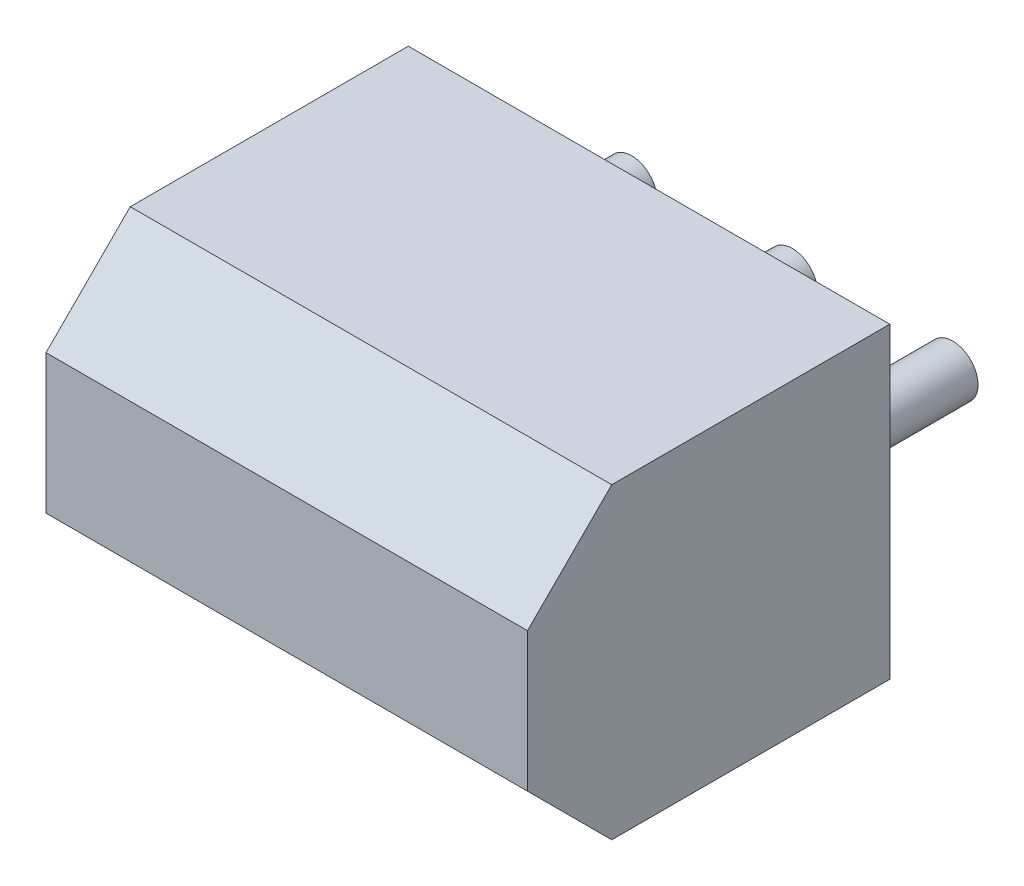
ISO-10303-21;
HEADER;
FILE_DESCRIPTION(('STEP AP214'),'2;1');
FILE_NAME('part.step','',(''),(''),'','','');
FILE_SCHEMA(('AUTOMOTIVE_DESIGN { 1 0 10303 214 1 1 1 1 }'));
ENDSEC;
DATA;
#1=APPLICATION_CONTEXT('core data for automotive mechanical design processes');
#2=APPLICATION_PROTOCOL_DEFINITION('international standard','automotive_design',2000,#1);
#3=PRODUCT_CONTEXT('',#1,'mechanical');
#4=PRODUCT('Part','Part','',(#3));
#5=PRODUCT_RELATED_PRODUCT_CATEGORY('part','',(#4));
#6=PRODUCT_DEFINITION_FORMATION('','',#4);
#7=PRODUCT_DEFINITION_CONTEXT('part definition',#1,'design');
#8=PRODUCT_DEFINITION('design','',#6,#7);
#9=PRODUCT_DEFINITION_SHAPE('','',#8);
#10=(LENGTH_UNIT() NAMED_UNIT(*) SI_UNIT(.MILLI.,.METRE.));
#11=(NAMED_UNIT(*) PLANE_ANGLE_UNIT() SI_UNIT($,.RADIAN.));
#12=(NAMED_UNIT(*) SI_UNIT($,.STERADIAN.) SOLID_ANGLE_UNIT());
#13=UNCERTAINTY_MEASURE_WITH_UNIT(LENGTH_MEASURE(1.E-05),#10,'distance_accuracy_value','');
#14=(GEOMETRIC_REPRESENTATION_CONTEXT(3) GLOBAL_UNCERTAINTY_ASSIGNED_CONTEXT((#13)) GLOBAL_UNIT_ASSIGNED_CONTEXT((#10,
#11,#12)) REPRESENTATION_CONTEXT('',''));
#15=CARTESIAN_POINT('',(0.,0.,0.));
#16=DIRECTION('',(0.,0.,1.));
#17=DIRECTION('',(1.,0.,0.));
#18=AXIS2_PLACEMENT_3D('',#15,#16,#17);
#19=CARTESIAN_POINT('',(0.,0.,0.));
#20=DIRECTION('',(0.,0.,-1.));
#21=DIRECTION('',(-1.,0.,0.));
#22=AXIS2_PLACEMENT_3D('',#19,#20,#21);
#23=PLANE('',#22);
#24=CARTESIAN_POINT('',(9.525,3.7,0.));
#25=DIRECTION('',(0.,0.,-1.));
#26=DIRECTION('',(-1.,0.,0.));
#27=AXIS2_PLACEMENT_3D('',#24,#25,#26);
#28=CIRCLE('',#27,0.6);
#29=CARTESIAN_POINT('',(8.925,3.7,0.));
#30=VERTEX_POINT('',#29);
#31=EDGE_CURVE('E431',#30,#30,#28,.T.);
#32=ORIENTED_EDGE('',*,*,#31,.F.);
#33=EDGE_LOOP('',(#32));
#34=FACE_BOUND('',#33,.T.);
#35=DIRECTION('',(0.,-1.,0.));
#36=VECTOR('',#35,1.);
#37=CARTESIAN_POINT('',(0.,0.,0.));
#38=LINE('',#37,#36);
#39=CARTESIAN_POINT('',(0.,7.3,0.));
#40=VERTEX_POINT('',#39);
#41=CARTESIAN_POINT('',(0.,0.,0.));
#42=VERTEX_POINT('',#41);
#43=EDGE_CURVE('E257',#40,#42,#38,.T.);
#44=ORIENTED_EDGE('',*,*,#43,.F.);
#45=DIRECTION('',(-1.,0.,0.));
#46=VECTOR('',#45,1.);
#47=CARTESIAN_POINT('',(0.,7.3,0.));
#48=LINE('',#47,#46);
#49=CARTESIAN_POINT('',(11.43,7.3,0.));
#50=VERTEX_POINT('',#49);
#51=EDGE_CURVE('E268',#50,#40,#48,.T.);
#52=ORIENTED_EDGE('',*,*,#51,.F.);
#53=DIRECTION('',(0.,1.,0.));
#54=VECTOR('',#53,1.);
#55=CARTESIAN_POINT('',(11.43,0.,0.));
#56=LINE('',#55,#54);
#57=CARTESIAN_POINT('',(11.43,0.,0.));
#58=VERTEX_POINT('',#57);
#59=EDGE_CURVE('E277',#58,#50,#56,.T.);
#60=ORIENTED_EDGE('',*,*,#59,.F.);
#61=DIRECTION('',(1.,0.,0.));
#62=VECTOR('',#61,1.);
#63=CARTESIAN_POINT('',(0.,0.,0.));
#64=LINE('',#63,#62);
#65=EDGE_CURVE('E274',#42,#58,#64,.T.);
#66=ORIENTED_EDGE('',*,*,#65,.F.);
#67=EDGE_LOOP('',(#44,#52,#60,#66));
#68=FACE_BOUND('',#67,.T.);
#69=CARTESIAN_POINT('',(5.715,3.7,0.));
#70=DIRECTION('',(0.,0.,-1.));
#71=DIRECTION('',(-1.,0.,0.));
#72=AXIS2_PLACEMENT_3D('',#69,#70,#71);
#73=CIRCLE('',#72,0.6);
#74=CARTESIAN_POINT('',(5.115,3.7,0.));
#75=VERTEX_POINT('',#74);
#76=EDGE_CURVE('E185',#75,#75,#73,.T.);
#77=ORIENTED_EDGE('',*,*,#76,.F.);
#78=EDGE_LOOP('',(#77));
#79=FACE_BOUND('',#78,.T.);
#80=CARTESIAN_POINT('',(1.905,3.7,0.));
#81=DIRECTION('',(0.,0.,-1.));
#82=DIRECTION('',(-1.,0.,0.));
#83=AXIS2_PLACEMENT_3D('',#80,#81,#82);
#84=CIRCLE('',#83,0.6);
#85=CARTESIAN_POINT('',(1.305,3.7,0.));
#86=VERTEX_POINT('',#85);
#87=EDGE_CURVE('E432',#86,#86,#84,.T.);
#88=ORIENTED_EDGE('',*,*,#87,.F.);
#89=EDGE_LOOP('',(#88));
#90=FACE_BOUND('',#89,.T.);
#91=ADVANCED_FACE('F35',(#34,#68,#79,#90),#23,.T.);
#92=CARTESIAN_POINT('',(0.,0.,8.6));
#93=DIRECTION('',(1.,0.,0.));
#94=DIRECTION('',(0.,0.,-1.));
#95=AXIS2_PLACEMENT_3D('',#92,#93,#94);
#96=PLANE('',#95);
#97=DIRECTION('',(0.,0.,-1.));
#98=VECTOR('',#97,1.);
#99=CARTESIAN_POINT('',(0.,0.,8.6));
#100=LINE('',#99,#98);
#101=CARTESIAN_POINT('',(0.,0.,6.59999999999999));
#102=VERTEX_POINT('',#101);
#103=EDGE_CURVE('E287',#102,#42,#100,.T.);
#104=ORIENTED_EDGE('',*,*,#103,.F.);
#105=DIRECTION('',(0.,-0.707106781186546,-0.707106781186549));
#106=VECTOR('',#105,1.);
#107=CARTESIAN_POINT('',(0.,2.,8.6));
#108=LINE('',#107,#106);
#109=CARTESIAN_POINT('',(0.,2.,8.6));
#110=VERTEX_POINT('',#109);
#111=EDGE_CURVE('E43',#102,#110,#108,.F.);
#112=ORIENTED_EDGE('',*,*,#111,.T.);
#113=DIRECTION('',(0.,-1.,0.));
#114=VECTOR('',#113,1.);
#115=CARTESIAN_POINT('',(0.,0.,8.6));
#116=LINE('',#115,#114);
#117=CARTESIAN_POINT('',(0.,5.3,8.6));
#118=VERTEX_POINT('',#117);
#119=EDGE_CURVE('E264',#118,#110,#116,.T.);
#120=ORIENTED_EDGE('',*,*,#119,.F.);
#121=DIRECTION('',(0.,-0.707106781186546,0.707106781186549));
#122=VECTOR('',#121,1.);
#123=CARTESIAN_POINT('',(0.,5.3,8.6));
#124=LINE('',#123,#122);
#125=CARTESIAN_POINT('',(0.,7.3,6.59999999999999));
#126=VERTEX_POINT('',#125);
#127=EDGE_CURVE('E301',#118,#126,#124,.F.);
#128=ORIENTED_EDGE('',*,*,#127,.T.);
#129=DIRECTION('',(0.,0.,-1.));
#130=VECTOR('',#129,1.);
#131=CARTESIAN_POINT('',(0.,7.3,8.6));
#132=LINE('',#131,#130);
#133=EDGE_CURVE('E271',#126,#40,#132,.T.);
#134=ORIENTED_EDGE('',*,*,#133,.T.);
#135=ORIENTED_EDGE('',*,*,#43,.T.);
#136=EDGE_LOOP('',(#104,#112,#120,#128,#134,#135));
#137=FACE_BOUND('',#136,.T.);
#138=ADVANCED_FACE('F306',(#137),#96,.F.);
#139=CARTESIAN_POINT('',(0.,0.,8.6));
#140=DIRECTION('',(0.,1.,0.));
#141=DIRECTION('',(0.,0.,1.));
#142=AXIS2_PLACEMENT_3D('',#139,#140,#141);
#143=PLANE('',#142);
#144=DIRECTION('',(1.,0.,0.));
#145=VECTOR('',#144,1.);
#146=CARTESIAN_POINT('',(8.775,0.,2.47967746024681));
#147=LINE('',#146,#145);
#148=CARTESIAN_POINT('',(8.775,0.,2.47967746024681));
#149=VERTEX_POINT('',#148);
#150=CARTESIAN_POINT('',(10.275,0.,2.47967746024681));
#151=VERTEX_POINT('',#150);
#152=EDGE_CURVE('E191',#149,#151,#147,.T.);
#153=ORIENTED_EDGE('',*,*,#152,.F.);
#154=DIRECTION('',(0.,0.,-1.));
#155=VECTOR('',#154,1.);
#156=CARTESIAN_POINT('',(8.775,0.,4.72443805466153));
#157=LINE('',#156,#155);
#158=CARTESIAN_POINT('',(8.775,0.,4.72443805466153));
#159=VERTEX_POINT('',#158);
#160=EDGE_CURVE('E50',#159,#149,#157,.T.);
#161=ORIENTED_EDGE('',*,*,#160,.F.);
#162=DIRECTION('',(-1.,0.,0.));
#163=VECTOR('',#162,1.);
#164=CARTESIAN_POINT('',(8.775,0.,4.72443805466153));
#165=LINE('',#164,#163);
#166=CARTESIAN_POINT('',(10.275,0.,4.72443805466153));
#167=VERTEX_POINT('',#166);
#168=EDGE_CURVE('E179',#167,#159,#165,.T.);
#169=ORIENTED_EDGE('',*,*,#168,.F.);
#170=DIRECTION('',(0.,0.,1.));
#171=VECTOR('',#170,1.);
#172=CARTESIAN_POINT('',(10.275,0.,4.72443805466153));
#173=LINE('',#172,#171);
#174=EDGE_CURVE('E182',#151,#167,#173,.T.);
#175=ORIENTED_EDGE('',*,*,#174,.F.);
#176=EDGE_LOOP('',(#153,#161,#169,#175));
#177=FACE_BOUND('',#176,.T.);
#178=DIRECTION('',(1.,0.,0.));
#179=VECTOR('',#178,1.);
#180=CARTESIAN_POINT('',(1.155,0.,2.47967746024681));
#181=LINE('',#180,#179);
#182=CARTESIAN_POINT('',(1.155,0.,2.47967746024681));
#183=VERTEX_POINT('',#182);
#184=CARTESIAN_POINT('',(2.655,0.,2.47967746024681));
#185=VERTEX_POINT('',#184);
#186=EDGE_CURVE('E216',#183,#185,#181,.T.);
#187=ORIENTED_EDGE('',*,*,#186,.F.);
#188=DIRECTION('',(0.,0.,-1.));
#189=VECTOR('',#188,1.);
#190=CARTESIAN_POINT('',(1.155,0.,4.72443805466153));
#191=LINE('',#190,#189);
#192=CARTESIAN_POINT('',(1.155,0.,4.72443805466153));
#193=VERTEX_POINT('',#192);
#194=EDGE_CURVE('E58',#193,#183,#191,.T.);
#195=ORIENTED_EDGE('',*,*,#194,.F.);
#196=DIRECTION('',(-1.,0.,0.));
#197=VECTOR('',#196,1.);
#198=CARTESIAN_POINT('',(1.155,0.,4.72443805466153));
#199=LINE('',#198,#197);
#200=CARTESIAN_POINT('',(2.655,0.,4.72443805466153));
#201=VERTEX_POINT('',#200);
#202=EDGE_CURVE('E205',#201,#193,#199,.T.);
#203=ORIENTED_EDGE('',*,*,#202,.F.);
#204=DIRECTION('',(0.,0.,1.));
#205=VECTOR('',#204,1.);
#206=CARTESIAN_POINT('',(2.655,0.,4.72443805466153));
#207=LINE('',#206,#205);
#208=EDGE_CURVE('E219',#185,#201,#207,.T.);
#209=ORIENTED_EDGE('',*,*,#208,.F.);
#210=EDGE_LOOP('',(#187,#195,#203,#209));
#211=FACE_BOUND('',#210,.T.);
#212=DIRECTION('',(1.,0.,0.));
#213=VECTOR('',#212,1.);
#214=CARTESIAN_POINT('',(4.965,0.,2.47967746024681));
#215=LINE('',#214,#213);
#216=CARTESIAN_POINT('',(4.965,0.,2.47967746024681));
#217=VERTEX_POINT('',#216);
#218=CARTESIAN_POINT('',(6.465,0.,2.47967746024681));
#219=VERTEX_POINT('',#218);
#220=EDGE_CURVE('E247',#217,#219,#215,.T.);
#221=ORIENTED_EDGE('',*,*,#220,.F.);
#222=DIRECTION('',(0.,0.,-1.));
#223=VECTOR('',#222,1.);
#224=CARTESIAN_POINT('',(4.965,0.,4.72443805466153));
#225=LINE('',#224,#223);
#226=CARTESIAN_POINT('',(4.965,0.,4.72443805466153));
#227=VERTEX_POINT('',#226);
#228=EDGE_CURVE('E226',#227,#217,#225,.T.);
#229=ORIENTED_EDGE('',*,*,#228,.F.);
#230=DIRECTION('',(-1.,0.,0.));
#231=VECTOR('',#230,1.);
#232=CARTESIAN_POINT('',(4.965,0.,4.72443805466153));
#233=LINE('',#232,#231);
#234=CARTESIAN_POINT('',(6.465,0.,4.72443805466153));
#235=VERTEX_POINT('',#234);
#236=EDGE_CURVE('E236',#235,#227,#233,.T.);
#237=ORIENTED_EDGE('',*,*,#236,.F.);
#238=DIRECTION('',(0.,0.,1.));
#239=VECTOR('',#238,1.);
#240=CARTESIAN_POINT('',(6.465,0.,4.72443805466153));
#241=LINE('',#240,#239);
#242=EDGE_CURVE('E250',#219,#235,#241,.T.);
#243=ORIENTED_EDGE('',*,*,#242,.F.);
#244=EDGE_LOOP('',(#221,#229,#237,#243));
#245=FACE_BOUND('',#244,.T.);
#246=DIRECTION('',(0.,0.,-1.));
#247=VECTOR('',#246,1.);
#248=CARTESIAN_POINT('',(11.43,0.,8.6));
#249=LINE('',#248,#247);
#250=CARTESIAN_POINT('',(11.43,0.,6.59999999999999));
#251=VERTEX_POINT('',#250);
#252=EDGE_CURVE('E285',#251,#58,#249,.T.);
#253=ORIENTED_EDGE('',*,*,#252,.F.);
#254=DIRECTION('',(-1.,0.,0.));
#255=VECTOR('',#254,1.);
#256=CARTESIAN_POINT('',(0.,0.,6.59999999999999));
#257=LINE('',#256,#255);
#258=EDGE_CURVE('E299',#251,#102,#257,.T.);
#259=ORIENTED_EDGE('',*,*,#258,.T.);
#260=ORIENTED_EDGE('',*,*,#103,.T.);
#261=ORIENTED_EDGE('',*,*,#65,.T.);
#262=EDGE_LOOP('',(#253,#259,#260,#261));
#263=FACE_BOUND('',#262,.T.);
#264=ADVANCED_FACE('F319',(#177,#211,#245,#263),#143,.F.);
#265=CARTESIAN_POINT('',(11.43,0.,8.6));
#266=DIRECTION('',(-1.,0.,0.));
#267=DIRECTION('',(0.,0.,1.));
#268=AXIS2_PLACEMENT_3D('',#265,#266,#267);
#269=PLANE('',#268);
#270=DIRECTION('',(0.,1.,0.));
#271=VECTOR('',#270,1.);
#272=CARTESIAN_POINT('',(11.43,0.,8.6));
#273=LINE('',#272,#271);
#274=CARTESIAN_POINT('',(11.43,2.,8.6));
#275=VERTEX_POINT('',#274);
#276=CARTESIAN_POINT('',(11.43,5.3,8.6));
#277=VERTEX_POINT('',#276);
#278=EDGE_CURVE('E267',#275,#277,#273,.T.);
#279=ORIENTED_EDGE('',*,*,#278,.F.);
#280=DIRECTION('',(0.,0.707106781186546,0.707106781186549));
#281=VECTOR('',#280,1.);
#282=CARTESIAN_POINT('',(11.43,2.,8.6));
#283=LINE('',#282,#281);
#284=EDGE_CURVE('E297',#275,#251,#283,.F.);
#285=ORIENTED_EDGE('',*,*,#284,.T.);
#286=ORIENTED_EDGE('',*,*,#252,.T.);
#287=ORIENTED_EDGE('',*,*,#59,.T.);
#288=DIRECTION('',(0.,0.,-1.));
#289=VECTOR('',#288,1.);
#290=CARTESIAN_POINT('',(11.43,7.3,8.6));
#291=LINE('',#290,#289);
#292=CARTESIAN_POINT('',(11.43,7.3,6.59999999999999));
#293=VERTEX_POINT('',#292);
#294=EDGE_CURVE('E283',#293,#50,#291,.T.);
#295=ORIENTED_EDGE('',*,*,#294,.F.);
#296=DIRECTION('',(0.,0.707106781186546,-0.707106781186549));
#297=VECTOR('',#296,1.);
#298=CARTESIAN_POINT('',(11.43,5.3,8.6));
#299=LINE('',#298,#297);
#300=EDGE_CURVE('E295',#293,#277,#299,.F.);
#301=ORIENTED_EDGE('',*,*,#300,.T.);
#302=EDGE_LOOP('',(#279,#285,#286,#287,#295,#301));
#303=FACE_BOUND('',#302,.T.);
#304=ADVANCED_FACE('F317',(#303),#269,.F.);
#305=CARTESIAN_POINT('',(0.,7.3,8.6));
#306=DIRECTION('',(0.,-1.,0.));
#307=DIRECTION('',(0.,0.,-1.));
#308=AXIS2_PLACEMENT_3D('',#305,#306,#307);
#309=PLANE('',#308);
#310=ORIENTED_EDGE('',*,*,#133,.F.);
#311=DIRECTION('',(1.,0.,0.));
#312=VECTOR('',#311,1.);
#313=CARTESIAN_POINT('',(0.,7.3,6.59999999999999));
#314=LINE('',#313,#312);
#315=EDGE_CURVE('E11',#126,#293,#314,.T.);
#316=ORIENTED_EDGE('',*,*,#315,.T.);
#317=ORIENTED_EDGE('',*,*,#294,.T.);
#318=ORIENTED_EDGE('',*,*,#51,.T.);
#319=EDGE_LOOP('',(#310,#316,#317,#318));
#320=FACE_BOUND('',#319,.T.);
#321=ADVANCED_FACE('F332',(#320),#309,.F.);
#322=CARTESIAN_POINT('',(0.,0.,8.6));
#323=DIRECTION('',(0.,0.,-1.));
#324=DIRECTION('',(-1.,0.,0.));
#325=AXIS2_PLACEMENT_3D('',#322,#323,#324);
#326=PLANE('',#325);
#327=ORIENTED_EDGE('',*,*,#119,.T.);
#328=DIRECTION('',(1.,0.,0.));
#329=VECTOR('',#328,1.);
#330=CARTESIAN_POINT('',(0.,2.,8.6));
#331=LINE('',#330,#329);
#332=EDGE_CURVE('E292',#110,#275,#331,.T.);
#333=ORIENTED_EDGE('',*,*,#332,.T.);
#334=ORIENTED_EDGE('',*,*,#278,.T.);
#335=DIRECTION('',(-1.,0.,0.));
#336=VECTOR('',#335,1.);
#337=CARTESIAN_POINT('',(0.,5.3,8.6));
#338=LINE('',#337,#336);
#339=EDGE_CURVE('E289',#277,#118,#338,.T.);
#340=ORIENTED_EDGE('',*,*,#339,.T.);
#341=EDGE_LOOP('',(#327,#333,#334,#340));
#342=FACE_BOUND('',#341,.T.);
#343=ADVANCED_FACE('F311',(#342),#326,.F.);
#344=CARTESIAN_POINT('',(0.,2.,8.6));
#345=DIRECTION('',(0.,0.707106781186549,-0.707106781186546));
#346=DIRECTION('',(1.,0.,0.));
#347=AXIS2_PLACEMENT_3D('',#344,#345,#346);
#348=PLANE('',#347);
#349=ORIENTED_EDGE('',*,*,#111,.F.);
#350=ORIENTED_EDGE('',*,*,#258,.F.);
#351=ORIENTED_EDGE('',*,*,#284,.F.);
#352=ORIENTED_EDGE('',*,*,#332,.F.);
#353=EDGE_LOOP('',(#349,#350,#351,#352));
#354=FACE_BOUND('',#353,.T.);
#355=ADVANCED_FACE('F314',(#354),#348,.F.);
#356=CARTESIAN_POINT('',(0.,5.3,8.6));
#357=DIRECTION('',(0.,-0.707106781186549,-0.707106781186546));
#358=DIRECTION('',(-1.,0.,0.));
#359=AXIS2_PLACEMENT_3D('',#356,#357,#358);
#360=PLANE('',#359);
#361=ORIENTED_EDGE('',*,*,#300,.F.);
#362=ORIENTED_EDGE('',*,*,#315,.F.);
#363=ORIENTED_EDGE('',*,*,#127,.F.);
#364=ORIENTED_EDGE('',*,*,#339,.F.);
#365=EDGE_LOOP('',(#361,#362,#363,#364));
#366=FACE_BOUND('',#365,.T.);
#367=ADVANCED_FACE('F37',(#366),#360,.F.);
#368=CARTESIAN_POINT('',(4.965,0.5,4.72443805466153));
#369=DIRECTION('',(-1.,0.,0.));
#370=DIRECTION('',(0.,0.,1.));
#371=AXIS2_PLACEMENT_3D('',#368,#369,#370);
#372=PLANE('',#371);
#373=ORIENTED_EDGE('',*,*,#228,.T.);
#374=DIRECTION('',(0.,-1.,0.));
#375=VECTOR('',#374,1.);
#376=CARTESIAN_POINT('',(4.965,0.5,2.47967746024681));
#377=LINE('',#376,#375);
#378=CARTESIAN_POINT('',(4.965,0.5,2.47967746024681));
#379=VERTEX_POINT('',#378);
#380=EDGE_CURVE('E245',#379,#217,#377,.T.);
#381=ORIENTED_EDGE('',*,*,#380,.F.);
#382=DIRECTION('',(0.,0.,-1.));
#383=VECTOR('',#382,1.);
#384=CARTESIAN_POINT('',(4.965,0.5,4.72443805466153));
#385=LINE('',#384,#383);
#386=CARTESIAN_POINT('',(4.965,0.5,4.72443805466153));
#387=VERTEX_POINT('',#386);
#388=EDGE_CURVE('E232',#387,#379,#385,.T.);
#389=ORIENTED_EDGE('',*,*,#388,.F.);
#390=DIRECTION('',(0.,-1.,0.));
#391=VECTOR('',#390,1.);
#392=CARTESIAN_POINT('',(4.965,0.5,4.72443805466153));
#393=LINE('',#392,#391);
#394=EDGE_CURVE('E255',#387,#227,#393,.T.);
#395=ORIENTED_EDGE('',*,*,#394,.T.);
#396=EDGE_LOOP('',(#373,#381,#389,#395));
#397=FACE_BOUND('',#396,.T.);
#398=ADVANCED_FACE('F350',(#397),#372,.F.);
#399=CARTESIAN_POINT('',(4.965,0.5,4.72443805466153));
#400=DIRECTION('',(0.,0.,1.));
#401=DIRECTION('',(1.,0.,0.));
#402=AXIS2_PLACEMENT_3D('',#399,#400,#401);
#403=PLANE('',#402);
#404=ORIENTED_EDGE('',*,*,#236,.T.);
#405=ORIENTED_EDGE('',*,*,#394,.F.);
#406=DIRECTION('',(-1.,0.,0.));
#407=VECTOR('',#406,1.);
#408=CARTESIAN_POINT('',(4.965,0.5,4.72443805466153));
#409=LINE('',#408,#407);
#410=CARTESIAN_POINT('',(6.465,0.5,4.72443805466153));
#411=VERTEX_POINT('',#410);
#412=EDGE_CURVE('E242',#411,#387,#409,.T.);
#413=ORIENTED_EDGE('',*,*,#412,.F.);
#414=DIRECTION('',(0.,-1.,0.));
#415=VECTOR('',#414,1.);
#416=CARTESIAN_POINT('',(6.465,0.5,4.72443805466153));
#417=LINE('',#416,#415);
#418=EDGE_CURVE('E258',#411,#235,#417,.T.);
#419=ORIENTED_EDGE('',*,*,#418,.T.);
#420=EDGE_LOOP('',(#404,#405,#413,#419));
#421=FACE_BOUND('',#420,.T.);
#422=ADVANCED_FACE('F353',(#421),#403,.F.);
#423=CARTESIAN_POINT('',(6.465,0.5,4.72443805466153));
#424=DIRECTION('',(1.,0.,0.));
#425=DIRECTION('',(0.,0.,-1.));
#426=AXIS2_PLACEMENT_3D('',#423,#424,#425);
#427=PLANE('',#426);
#428=ORIENTED_EDGE('',*,*,#242,.T.);
#429=ORIENTED_EDGE('',*,*,#418,.F.);
#430=DIRECTION('',(0.,0.,1.));
#431=VECTOR('',#430,1.);
#432=CARTESIAN_POINT('',(6.465,0.5,4.72443805466153));
#433=LINE('',#432,#431);
#434=CARTESIAN_POINT('',(6.465,0.5,2.47967746024681));
#435=VERTEX_POINT('',#434);
#436=EDGE_CURVE('E239',#435,#411,#433,.T.);
#437=ORIENTED_EDGE('',*,*,#436,.F.);
#438=DIRECTION('',(0.,-1.,0.));
#439=VECTOR('',#438,1.);
#440=CARTESIAN_POINT('',(6.465,0.5,2.47967746024681));
#441=LINE('',#440,#439);
#442=EDGE_CURVE('E260',#435,#219,#441,.T.);
#443=ORIENTED_EDGE('',*,*,#442,.T.);
#444=EDGE_LOOP('',(#428,#429,#437,#443));
#445=FACE_BOUND('',#444,.T.);
#446=ADVANCED_FACE('F359',(#445),#427,.F.);
#447=CARTESIAN_POINT('',(4.965,0.5,2.47967746024681));
#448=DIRECTION('',(0.,0.,-1.));
#449=DIRECTION('',(-1.,0.,0.));
#450=AXIS2_PLACEMENT_3D('',#447,#448,#449);
#451=PLANE('',#450);
#452=ORIENTED_EDGE('',*,*,#220,.T.);
#453=ORIENTED_EDGE('',*,*,#442,.F.);
#454=DIRECTION('',(1.,0.,0.));
#455=VECTOR('',#454,1.);
#456=CARTESIAN_POINT('',(4.965,0.5,2.47967746024681));
#457=LINE('',#456,#455);
#458=EDGE_CURVE('E235',#379,#435,#457,.T.);
#459=ORIENTED_EDGE('',*,*,#458,.F.);
#460=ORIENTED_EDGE('',*,*,#380,.T.);
#461=EDGE_LOOP('',(#452,#453,#459,#460));
#462=FACE_BOUND('',#461,.T.);
#463=ADVANCED_FACE('F355',(#462),#451,.F.);
#464=CARTESIAN_POINT('',(0.,0.5,0.));
#465=DIRECTION('',(0.,-1.,0.));
#466=DIRECTION('',(0.,0.,-1.));
#467=AXIS2_PLACEMENT_3D('',#464,#465,#466);
#468=PLANE('',#467);
#469=ORIENTED_EDGE('',*,*,#388,.T.);
#470=ORIENTED_EDGE('',*,*,#458,.T.);
#471=ORIENTED_EDGE('',*,*,#436,.T.);
#472=ORIENTED_EDGE('',*,*,#412,.T.);
#473=EDGE_LOOP('',(#469,#470,#471,#472));
#474=FACE_BOUND('',#473,.T.);
#475=ADVANCED_FACE('F358',(#474),#468,.T.);
#476=CARTESIAN_POINT('',(1.155,0.5,4.72443805466153));
#477=DIRECTION('',(-1.,0.,0.));
#478=DIRECTION('',(0.,0.,1.));
#479=AXIS2_PLACEMENT_3D('',#476,#477,#478);
#480=PLANE('',#479);
#481=ORIENTED_EDGE('',*,*,#194,.T.);
#482=DIRECTION('',(0.,-1.,0.));
#483=VECTOR('',#482,1.);
#484=CARTESIAN_POINT('',(1.155,0.5,2.47967746024681));
#485=LINE('',#484,#483);
#486=CARTESIAN_POINT('',(1.155,0.5,2.47967746024681));
#487=VERTEX_POINT('',#486);
#488=EDGE_CURVE('E214',#487,#183,#485,.T.);
#489=ORIENTED_EDGE('',*,*,#488,.F.);
#490=DIRECTION('',(0.,0.,-1.));
#491=VECTOR('',#490,1.);
#492=CARTESIAN_POINT('',(1.155,0.5,4.72443805466153));
#493=LINE('',#492,#491);
#494=CARTESIAN_POINT('',(1.155,0.5,4.72443805466153));
#495=VERTEX_POINT('',#494);
#496=EDGE_CURVE('E201',#495,#487,#493,.T.);
#497=ORIENTED_EDGE('',*,*,#496,.F.);
#498=DIRECTION('',(0.,-1.,0.));
#499=VECTOR('',#498,1.);
#500=CARTESIAN_POINT('',(1.155,0.5,4.72443805466153));
#501=LINE('',#500,#499);
#502=EDGE_CURVE('E224',#495,#193,#501,.T.);
#503=ORIENTED_EDGE('',*,*,#502,.T.);
#504=EDGE_LOOP('',(#481,#489,#497,#503));
#505=FACE_BOUND('',#504,.T.);
#506=ADVANCED_FACE('F369',(#505),#480,.F.);
#507=CARTESIAN_POINT('',(1.155,0.5,4.72443805466153));
#508=DIRECTION('',(0.,0.,1.));
#509=DIRECTION('',(1.,0.,0.));
#510=AXIS2_PLACEMENT_3D('',#507,#508,#509);
#511=PLANE('',#510);
#512=ORIENTED_EDGE('',*,*,#202,.T.);
#513=ORIENTED_EDGE('',*,*,#502,.F.);
#514=DIRECTION('',(-1.,0.,0.));
#515=VECTOR('',#514,1.);
#516=CARTESIAN_POINT('',(1.155,0.5,4.72443805466153));
#517=LINE('',#516,#515);
#518=CARTESIAN_POINT('',(2.655,0.5,4.72443805466153));
#519=VERTEX_POINT('',#518);
#520=EDGE_CURVE('E211',#519,#495,#517,.T.);
#521=ORIENTED_EDGE('',*,*,#520,.F.);
#522=DIRECTION('',(0.,-1.,0.));
#523=VECTOR('',#522,1.);
#524=CARTESIAN_POINT('',(2.655,0.5,4.72443805466153));
#525=LINE('',#524,#523);
#526=EDGE_CURVE('E227',#519,#201,#525,.T.);
#527=ORIENTED_EDGE('',*,*,#526,.T.);
#528=EDGE_LOOP('',(#512,#513,#521,#527));
#529=FACE_BOUND('',#528,.T.);
#530=ADVANCED_FACE('F373',(#529),#511,.F.);
#531=CARTESIAN_POINT('',(2.655,0.5,4.72443805466153));
#532=DIRECTION('',(1.,0.,0.));
#533=DIRECTION('',(0.,0.,-1.));
#534=AXIS2_PLACEMENT_3D('',#531,#532,#533);
#535=PLANE('',#534);
#536=ORIENTED_EDGE('',*,*,#208,.T.);
#537=ORIENTED_EDGE('',*,*,#526,.F.);
#538=DIRECTION('',(0.,0.,1.));
#539=VECTOR('',#538,1.);
#540=CARTESIAN_POINT('',(2.655,0.5,4.72443805466153));
#541=LINE('',#540,#539);
#542=CARTESIAN_POINT('',(2.655,0.5,2.47967746024681));
#543=VERTEX_POINT('',#542);
#544=EDGE_CURVE('E208',#543,#519,#541,.T.);
#545=ORIENTED_EDGE('',*,*,#544,.F.);
#546=DIRECTION('',(0.,-1.,0.));
#547=VECTOR('',#546,1.);
#548=CARTESIAN_POINT('',(2.655,0.5,2.47967746024681));
#549=LINE('',#548,#547);
#550=EDGE_CURVE('E229',#543,#185,#549,.T.);
#551=ORIENTED_EDGE('',*,*,#550,.T.);
#552=EDGE_LOOP('',(#536,#537,#545,#551));
#553=FACE_BOUND('',#552,.T.);
#554=ADVANCED_FACE('F378',(#553),#535,.F.);
#555=CARTESIAN_POINT('',(1.155,0.5,2.47967746024681));
#556=DIRECTION('',(0.,0.,-1.));
#557=DIRECTION('',(-1.,0.,0.));
#558=AXIS2_PLACEMENT_3D('',#555,#556,#557);
#559=PLANE('',#558);
#560=ORIENTED_EDGE('',*,*,#186,.T.);
#561=ORIENTED_EDGE('',*,*,#550,.F.);
#562=DIRECTION('',(1.,0.,0.));
#563=VECTOR('',#562,1.);
#564=CARTESIAN_POINT('',(1.155,0.5,2.47967746024681));
#565=LINE('',#564,#563);
#566=EDGE_CURVE('E204',#487,#543,#565,.T.);
#567=ORIENTED_EDGE('',*,*,#566,.F.);
#568=ORIENTED_EDGE('',*,*,#488,.T.);
#569=EDGE_LOOP('',(#560,#561,#567,#568));
#570=FACE_BOUND('',#569,.T.);
#571=ADVANCED_FACE('F374',(#570),#559,.F.);
#572=CARTESIAN_POINT('',(-3.81,0.5,0.));
#573=DIRECTION('',(0.,-1.,0.));
#574=DIRECTION('',(0.,0.,-1.));
#575=AXIS2_PLACEMENT_3D('',#572,#573,#574);
#576=PLANE('',#575);
#577=ORIENTED_EDGE('',*,*,#496,.T.);
#578=ORIENTED_EDGE('',*,*,#566,.T.);
#579=ORIENTED_EDGE('',*,*,#544,.T.);
#580=ORIENTED_EDGE('',*,*,#520,.T.);
#581=EDGE_LOOP('',(#577,#578,#579,#580));
#582=FACE_BOUND('',#581,.T.);
#583=ADVANCED_FACE('F377',(#582),#576,.T.);
#584=CARTESIAN_POINT('',(8.775,0.5,4.72443805466153));
#585=DIRECTION('',(-1.,0.,0.));
#586=DIRECTION('',(0.,0.,1.));
#587=AXIS2_PLACEMENT_3D('',#584,#585,#586);
#588=PLANE('',#587);
#589=ORIENTED_EDGE('',*,*,#160,.T.);
#590=DIRECTION('',(0.,-1.,0.));
#591=VECTOR('',#590,1.);
#592=CARTESIAN_POINT('',(8.775,0.5,2.47967746024681));
#593=LINE('',#592,#591);
#594=CARTESIAN_POINT('',(8.775,0.5,2.47967746024681));
#595=VERTEX_POINT('',#594);
#596=EDGE_CURVE('E157',#595,#149,#593,.T.);
#597=ORIENTED_EDGE('',*,*,#596,.F.);
#598=DIRECTION('',(0.,0.,-1.));
#599=VECTOR('',#598,1.);
#600=CARTESIAN_POINT('',(8.775,0.5,4.72443805466153));
#601=LINE('',#600,#599);
#602=CARTESIAN_POINT('',(8.775,0.5,4.72443805466153));
#603=VERTEX_POINT('',#602);
#604=EDGE_CURVE('E161',#603,#595,#601,.T.);
#605=ORIENTED_EDGE('',*,*,#604,.F.);
#606=DIRECTION('',(0.,-1.,0.));
#607=VECTOR('',#606,1.);
#608=CARTESIAN_POINT('',(8.775,0.5,4.72443805466153));
#609=LINE('',#608,#607);
#610=EDGE_CURVE('E196',#603,#159,#609,.T.);
#611=ORIENTED_EDGE('',*,*,#610,.T.);
#612=EDGE_LOOP('',(#589,#597,#605,#611));
#613=FACE_BOUND('',#612,.T.);
#614=ADVANCED_FACE('F159',(#613),#588,.F.);
#615=CARTESIAN_POINT('',(8.775,0.5,4.72443805466153));
#616=DIRECTION('',(0.,0.,1.));
#617=DIRECTION('',(1.,0.,0.));
#618=AXIS2_PLACEMENT_3D('',#615,#616,#617);
#619=PLANE('',#618);
#620=ORIENTED_EDGE('',*,*,#168,.T.);
#621=ORIENTED_EDGE('',*,*,#610,.F.);
#622=DIRECTION('',(-1.,0.,0.));
#623=VECTOR('',#622,1.);
#624=CARTESIAN_POINT('',(8.775,0.5,4.72443805466153));
#625=LINE('',#624,#623);
#626=CARTESIAN_POINT('',(10.275,0.5,4.72443805466153));
#627=VERTEX_POINT('',#626);
#628=EDGE_CURVE('E167',#627,#603,#625,.T.);
#629=ORIENTED_EDGE('',*,*,#628,.F.);
#630=DIRECTION('',(0.,-1.,0.));
#631=VECTOR('',#630,1.);
#632=CARTESIAN_POINT('',(10.275,0.5,4.72443805466153));
#633=LINE('',#632,#631);
#634=EDGE_CURVE('E198',#627,#167,#633,.T.);
#635=ORIENTED_EDGE('',*,*,#634,.T.);
#636=EDGE_LOOP('',(#620,#621,#629,#635));
#637=FACE_BOUND('',#636,.T.);
#638=ADVANCED_FACE('F391',(#637),#619,.F.);
#639=CARTESIAN_POINT('',(10.275,0.5,4.72443805466153));
#640=DIRECTION('',(1.,0.,0.));
#641=DIRECTION('',(0.,0.,-1.));
#642=AXIS2_PLACEMENT_3D('',#639,#640,#641);
#643=PLANE('',#642);
#644=ORIENTED_EDGE('',*,*,#174,.T.);
#645=ORIENTED_EDGE('',*,*,#634,.F.);
#646=DIRECTION('',(0.,0.,1.));
#647=VECTOR('',#646,1.);
#648=CARTESIAN_POINT('',(10.275,0.5,4.72443805466153));
#649=LINE('',#648,#647);
#650=CARTESIAN_POINT('',(10.275,0.5,2.47967746024681));
#651=VERTEX_POINT('',#650);
#652=EDGE_CURVE('E175',#651,#627,#649,.T.);
#653=ORIENTED_EDGE('',*,*,#652,.F.);
#654=DIRECTION('',(0.,-1.,0.));
#655=VECTOR('',#654,1.);
#656=CARTESIAN_POINT('',(10.275,0.5,2.47967746024681));
#657=LINE('',#656,#655);
#658=EDGE_CURVE('E166',#651,#151,#657,.T.);
#659=ORIENTED_EDGE('',*,*,#658,.T.);
#660=EDGE_LOOP('',(#644,#645,#653,#659));
#661=FACE_BOUND('',#660,.T.);
#662=ADVANCED_FACE('F394',(#661),#643,.F.);
#663=CARTESIAN_POINT('',(8.775,0.5,2.47967746024681));
#664=DIRECTION('',(0.,0.,-1.));
#665=DIRECTION('',(-1.,0.,0.));
#666=AXIS2_PLACEMENT_3D('',#663,#664,#665);
#667=PLANE('',#666);
#668=ORIENTED_EDGE('',*,*,#152,.T.);
#669=ORIENTED_EDGE('',*,*,#658,.F.);
#670=DIRECTION('',(1.,0.,0.));
#671=VECTOR('',#670,1.);
#672=CARTESIAN_POINT('',(8.775,0.5,2.47967746024681));
#673=LINE('',#672,#671);
#674=EDGE_CURVE('E170',#595,#651,#673,.T.);
#675=ORIENTED_EDGE('',*,*,#674,.F.);
#676=ORIENTED_EDGE('',*,*,#596,.T.);
#677=EDGE_LOOP('',(#668,#669,#675,#676));
#678=FACE_BOUND('',#677,.T.);
#679=ADVANCED_FACE('F171',(#678),#667,.F.);
#680=CARTESIAN_POINT('',(3.81,0.5,0.));
#681=DIRECTION('',(0.,-1.,0.));
#682=DIRECTION('',(0.,0.,-1.));
#683=AXIS2_PLACEMENT_3D('',#680,#681,#682);
#684=PLANE('',#683);
#685=ORIENTED_EDGE('',*,*,#604,.T.);
#686=ORIENTED_EDGE('',*,*,#674,.T.);
#687=ORIENTED_EDGE('',*,*,#652,.T.);
#688=ORIENTED_EDGE('',*,*,#628,.T.);
#689=EDGE_LOOP('',(#685,#686,#687,#688));
#690=FACE_BOUND('',#689,.T.);
#691=ADVANCED_FACE('F177',(#690),#684,.T.);
#692=CARTESIAN_POINT('',(5.715,3.7,-3.4));
#693=DIRECTION('',(0.,0.,1.));
#694=DIRECTION('',(1.,0.,0.));
#695=AXIS2_PLACEMENT_3D('',#692,#693,#694);
#696=CYLINDRICAL_SURFACE('',#695,0.6);
#697=CARTESIAN_POINT('',(5.715,3.7,-3.4));
#698=DIRECTION('',(0.,0.,-1.));
#699=DIRECTION('',(-1.,0.,0.));
#700=AXIS2_PLACEMENT_3D('',#697,#698,#699);
#701=CIRCLE('',#700,0.6);
#702=CARTESIAN_POINT('',(5.115,3.7,-3.4));
#703=VERTEX_POINT('',#702);
#704=EDGE_CURVE('E192',#703,#703,#701,.T.);
#705=ORIENTED_EDGE('',*,*,#704,.F.);
#706=EDGE_LOOP('',(#705));
#707=FACE_BOUND('',#706,.T.);
#708=ORIENTED_EDGE('',*,*,#76,.T.);
#709=EDGE_LOOP('',(#708));
#710=FACE_BOUND('',#709,.T.);
#711=ADVANCED_FACE('F403',(#707,#710),#696,.T.);
#712=CARTESIAN_POINT('',(5.715,3.7,-3.4));
#713=DIRECTION('',(0.,0.,-1.));
#714=DIRECTION('',(-1.,0.,0.));
#715=AXIS2_PLACEMENT_3D('',#712,#713,#714);
#716=PLANE('',#715);
#717=ORIENTED_EDGE('',*,*,#704,.T.);
#718=EDGE_LOOP('',(#717));
#719=FACE_BOUND('',#718,.T.);
#720=ADVANCED_FACE('F406',(#719),#716,.T.);
#721=CARTESIAN_POINT('',(9.525,3.7,-3.4));
#722=DIRECTION('',(0.,0.,1.));
#723=DIRECTION('',(1.,0.,0.));
#724=AXIS2_PLACEMENT_3D('',#721,#722,#723);
#725=CYLINDRICAL_SURFACE('',#724,0.6);
#726=CARTESIAN_POINT('',(9.525,3.7,-3.4));
#727=DIRECTION('',(0.,0.,-1.));
#728=DIRECTION('',(-1.,0.,0.));
#729=AXIS2_PLACEMENT_3D('',#726,#727,#728);
#730=CIRCLE('',#729,0.6);
#731=CARTESIAN_POINT('',(8.925,3.7,-3.4));
#732=VERTEX_POINT('',#731);
#733=EDGE_CURVE('E435',#732,#732,#730,.T.);
#734=ORIENTED_EDGE('',*,*,#733,.F.);
#735=EDGE_LOOP('',(#734));
#736=FACE_BOUND('',#735,.T.);
#737=ORIENTED_EDGE('',*,*,#31,.T.);
#738=EDGE_LOOP('',(#737));
#739=FACE_BOUND('',#738,.T.);
#740=ADVANCED_FACE('F410',(#736,#739),#725,.T.);
#741=CARTESIAN_POINT('',(9.525,3.7,-3.4));
#742=DIRECTION('',(0.,0.,-1.));
#743=DIRECTION('',(-1.,0.,0.));
#744=AXIS2_PLACEMENT_3D('',#741,#742,#743);
#745=PLANE('',#744);
#746=ORIENTED_EDGE('',*,*,#733,.T.);
#747=EDGE_LOOP('',(#746));
#748=FACE_BOUND('',#747,.T.);
#749=ADVANCED_FACE('F414',(#748),#745,.T.);
#750=CARTESIAN_POINT('',(1.905,3.7,-3.4));
#751=DIRECTION('',(0.,0.,1.));
#752=DIRECTION('',(1.,0.,0.));
#753=AXIS2_PLACEMENT_3D('',#750,#751,#752);
#754=CYLINDRICAL_SURFACE('',#753,0.6);
#755=CARTESIAN_POINT('',(1.905,3.7,-3.4));
#756=DIRECTION('',(0.,0.,-1.));
#757=DIRECTION('',(-1.,0.,0.));
#758=AXIS2_PLACEMENT_3D('',#755,#756,#757);
#759=CIRCLE('',#758,0.6);
#760=CARTESIAN_POINT('',(1.305,3.7,-3.4));
#761=VERTEX_POINT('',#760);
#762=EDGE_CURVE('E430',#761,#761,#759,.T.);
#763=ORIENTED_EDGE('',*,*,#762,.F.);
#764=EDGE_LOOP('',(#763));
#765=FACE_BOUND('',#764,.T.);
#766=ORIENTED_EDGE('',*,*,#87,.T.);
#767=EDGE_LOOP('',(#766));
#768=FACE_BOUND('',#767,.T.);
#769=ADVANCED_FACE('F418',(#765,#768),#754,.T.);
#770=CARTESIAN_POINT('',(1.905,3.7,-3.4));
#771=DIRECTION('',(0.,0.,-1.));
#772=DIRECTION('',(-1.,0.,0.));
#773=AXIS2_PLACEMENT_3D('',#770,#771,#772);
#774=PLANE('',#773);
#775=ORIENTED_EDGE('',*,*,#762,.T.);
#776=EDGE_LOOP('',(#775));
#777=FACE_BOUND('',#776,.T.);
#778=ADVANCED_FACE('F422',(#777),#774,.T.);
#779=CLOSED_SHELL('',(#91,#138,#264,#304,#321,#343,#355,#367,#398,#422,#446,#463,#475,#506,#530,
#554,#571,#583,#614,#638,#662,#679,#691,#711,#720,#740,#749,#769,#778));
#780=MANIFOLD_SOLID_BREP('B2',#779);
#781=ADVANCED_BREP_SHAPE_REPRESENTATION('',(#18,#780),#14);
#782=SHAPE_DEFINITION_REPRESENTATION(#9,#781);
ENDSEC;
END-ISO-10303-21;
